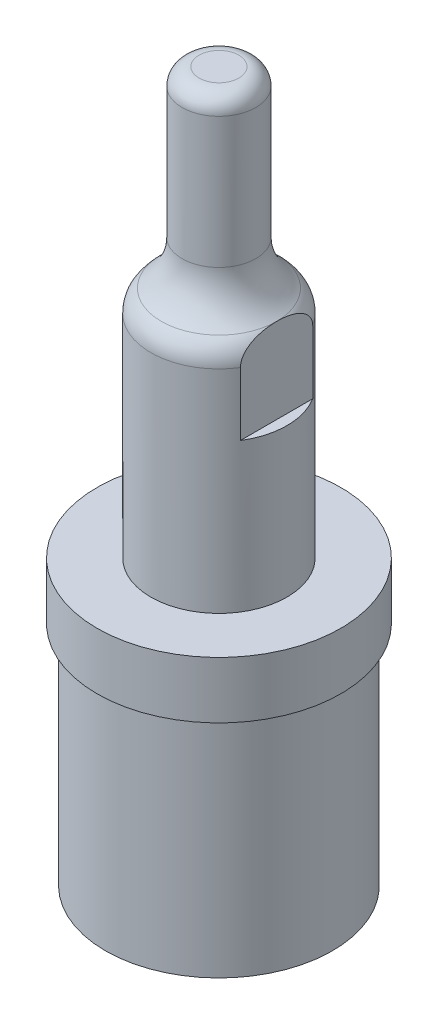
ISO-10303-21;
HEADER;
FILE_DESCRIPTION(('STEP AP214'),'2;1');
FILE_NAME('part.step','',(''),(''),'','','');
FILE_SCHEMA(('AUTOMOTIVE_DESIGN { 1 0 10303 214 1 1 1 1 }'));
ENDSEC;
DATA;
#1=APPLICATION_CONTEXT('core data for automotive mechanical design processes');
#2=APPLICATION_PROTOCOL_DEFINITION('international standard','automotive_design',2000,#1);
#3=PRODUCT_CONTEXT('',#1,'mechanical');
#4=PRODUCT('Part','Part','',(#3));
#5=PRODUCT_RELATED_PRODUCT_CATEGORY('part','',(#4));
#6=PRODUCT_DEFINITION_FORMATION('','',#4);
#7=PRODUCT_DEFINITION_CONTEXT('part definition',#1,'design');
#8=PRODUCT_DEFINITION('design','',#6,#7);
#9=PRODUCT_DEFINITION_SHAPE('','',#8);
#10=(LENGTH_UNIT() NAMED_UNIT(*) SI_UNIT(.MILLI.,.METRE.));
#11=(NAMED_UNIT(*) PLANE_ANGLE_UNIT() SI_UNIT($,.RADIAN.));
#12=(NAMED_UNIT(*) SI_UNIT($,.STERADIAN.) SOLID_ANGLE_UNIT());
#13=UNCERTAINTY_MEASURE_WITH_UNIT(LENGTH_MEASURE(1.E-05),#10,'distance_accuracy_value','');
#14=(GEOMETRIC_REPRESENTATION_CONTEXT(3) GLOBAL_UNCERTAINTY_ASSIGNED_CONTEXT((#13)) GLOBAL_UNIT_ASSIGNED_CONTEXT((#10,
#11,#12)) REPRESENTATION_CONTEXT('',''));
#15=CARTESIAN_POINT('',(0.,0.,0.));
#16=DIRECTION('',(0.,0.,1.));
#17=DIRECTION('',(1.,0.,0.));
#18=AXIS2_PLACEMENT_3D('',#15,#16,#17);
#19=CARTESIAN_POINT('',(0.,87.322098783502,0.));
#20=DIRECTION('',(0.,-1.,0.));
#21=DIRECTION('',(0.,0.,-1.));
#22=AXIS2_PLACEMENT_3D('',#19,#20,#21);
#23=TOROIDAL_SURFACE('',#22,7.,5.);
#24=CARTESIAN_POINT('',(-10.1666666666667,91.1914943722499,0.));
#25=CARTESIAN_POINT('',(-10.1666666666667,91.191506160614,-0.314516340477252));
#26=CARTESIAN_POINT('',(-10.1666666666667,91.1796408195498,-0.629088679360618));
#27=CARTESIAN_POINT('',(-10.1666666666667,91.1311122225233,-1.25661974532318));
#28=CARTESIAN_POINT('',(-10.1666666666667,91.0944278606387,-1.56957687040855));
#29=CARTESIAN_POINT('',(-10.1666666666667,90.9932609242664,-2.18959658683757));
#30=CARTESIAN_POINT('',(-10.1666666666667,90.9289086065314,-2.49667984223719));
#31=CARTESIAN_POINT('',(-10.1666666666667,90.7673827468785,-3.10182700025219));
#32=CARTESIAN_POINT('',(-10.1666666666667,90.6702707165493,-3.39990667399585));
#33=CARTESIAN_POINT('',(-10.1666666666667,90.4649616318458,-3.90944267609055));
#34=CARTESIAN_POINT('',(-10.1666666666667,90.3652586014093,-4.12428096224194));
#35=CARTESIAN_POINT('',(-10.1666666666667,90.1398738656151,-4.54019588368301));
#36=CARTESIAN_POINT('',(-10.1666666666667,90.0141834632251,-4.74126788183008));
#37=CARTESIAN_POINT('',(-10.1666666666667,89.7319876062989,-5.12491116960149));
#38=CARTESIAN_POINT('',(-10.1666666666667,89.575134078164,-5.30723451843851));
#39=CARTESIAN_POINT('',(-10.1666666666667,89.3169075524954,-5.55655948708843));
#40=CARTESIAN_POINT('',(-10.1666666666667,89.2270581827006,-5.63560772988774));
#41=CARTESIAN_POINT('',(-10.1666666666667,89.0398492007953,-5.78419602792949));
#42=CARTESIAN_POINT('',(-10.1666666666667,88.9424935910319,-5.85374109619261));
#43=CARTESIAN_POINT('',(-10.1666666666667,88.7043777054261,-6.004708852963));
#44=CARTESIAN_POINT('',(-10.1666666666667,88.5605777819698,-6.08143926547859));
#45=CARTESIAN_POINT('',(-10.1666666666667,88.2623046149878,-6.21013372051192));
#46=CARTESIAN_POINT('',(-10.1666666666667,88.1078388804566,-6.26211498753035));
#47=CARTESIAN_POINT('',(-10.1666666666667,87.7912581296236,-6.33817681629202));
#48=CARTESIAN_POINT('',(-10.1666666666667,87.6291084569419,-6.36211530892655));
#49=CARTESIAN_POINT('',(-10.1666666666667,87.3031652686577,-6.37979822710876));
#50=CARTESIAN_POINT('',(-10.1666666666667,87.1393720492714,-6.37354799937884));
#51=CARTESIAN_POINT('',(-10.1666666666667,86.8283165893434,-6.33301701032067));
#52=CARTESIAN_POINT('',(-10.1666666666667,86.6807578688158,-6.30094905745306));
#53=CARTESIAN_POINT('',(-10.1666666666667,86.3927568364649,-6.2135656943352));
#54=CARTESIAN_POINT('',(-10.1666666666667,86.2523151263568,-6.15824832210008));
#55=CARTESIAN_POINT('',(-10.1666666666667,85.9749737183359,-6.02424505400624));
#56=CARTESIAN_POINT('',(-10.1666666666667,85.8385486331851,-5.94458531296482));
#57=CARTESIAN_POINT('',(-10.1666666666667,85.5783546324541,-5.76684847671764));
#58=CARTESIAN_POINT('',(-10.1666666666667,85.4545930426994,-5.66876081297574));
#59=CARTESIAN_POINT('',(-10.1666666666667,85.1571270280625,-5.40077291813447));
#60=CARTESIAN_POINT('',(-10.1666666666667,84.992569461589,-5.22070731769872));
#61=CARTESIAN_POINT('',(-10.1666666666667,84.6942161424363,-4.836693389626));
#62=CARTESIAN_POINT('',(-10.1666666666667,84.5604888546468,-4.6326933970504));
#63=CARTESIAN_POINT('',(-10.1666666666667,84.3482870603166,-4.25745822759663));
#64=CARTESIAN_POINT('',(-10.1666666666667,84.2641650234201,-4.08934073774941));
#65=CARTESIAN_POINT('',(-10.1666666666667,84.1108871937879,-3.74634824925059));
#66=CARTESIAN_POINT('',(-10.1666666666667,84.0417400318126,-3.57146942176701));
#67=CARTESIAN_POINT('',(-10.1666666666667,83.9167374375909,-3.21660666599961));
#68=CARTESIAN_POINT('',(-10.1666666666667,83.860914441346,-3.03661144972391));
#69=CARTESIAN_POINT('',(-10.1666666666667,83.7613217278641,-2.67329299918218));
#70=CARTESIAN_POINT('',(-10.1666666666667,83.7175563849337,-2.48996858278148));
#71=CARTESIAN_POINT('',(-10.1666666666667,83.6142316245268,-1.9931129266992));
#72=CARTESIAN_POINT('',(-10.1666666666667,83.5647728150733,-1.67746606829269));
#73=CARTESIAN_POINT('',(-10.1666666666667,83.4925251318969,-1.04301805785404));
#74=CARTESIAN_POINT('',(-10.1666666666667,83.4697594427694,-0.724214405922573));
#75=CARTESIAN_POINT('',(-10.1666666666667,83.4488718444241,-0.0857390094152501));
#76=CARTESIAN_POINT('',(-10.1666666666667,83.4507562777562,0.233932937420648));
#77=CARTESIAN_POINT('',(-10.1666666666667,83.4793440438544,0.872012939291929));
#78=CARTESIAN_POINT('',(-10.1666666666667,83.5060296364433,1.1904217343809));
#79=CARTESIAN_POINT('',(-10.1666666666667,83.5710276289022,1.7008777030109));
#80=CARTESIAN_POINT('',(-10.1666666666667,83.6008139582872,1.89402793457452));
#81=CARTESIAN_POINT('',(-10.1666666666667,83.6716002149387,2.27824592033061));
#82=CARTESIAN_POINT('',(-10.1666666666667,83.712597333453,2.46931418368795));
#83=CARTESIAN_POINT('',(-10.1666666666667,83.8069650313993,2.84798694959647));
#84=CARTESIAN_POINT('',(-10.1666666666667,83.8603094867809,3.0355978747318));
#85=CARTESIAN_POINT('',(-10.1666666666667,83.9809155044474,3.40624098003433));
#86=CARTESIAN_POINT('',(-10.1666666666667,84.0481719238614,3.58927482427513));
#87=CARTESIAN_POINT('',(-10.1666666666667,84.2271327338105,4.01785551301749));
#88=CARTESIAN_POINT('',(-10.1666666666667,84.3459954186121,4.26050126246966));
#89=CARTESIAN_POINT('',(-10.1666666666667,84.6185177425266,4.7256455590055));
#90=CARTESIAN_POINT('',(-10.1666666666667,84.7721333588391,4.94816910073534));
#91=CARTESIAN_POINT('',(-10.1666666666667,85.0717320112034,5.30619507222789));
#92=CARTESIAN_POINT('',(-10.1666666666667,85.208833956332,5.44908235803831));
#93=CARTESIAN_POINT('',(-10.1666666666667,85.5040275178185,5.71133576647294));
#94=CARTESIAN_POINT('',(-10.1666666666667,85.6620906110436,5.83073331424164));
#95=CARTESIAN_POINT('',(-10.1666666666667,85.9682288753814,6.02064186757491));
#96=CARTESIAN_POINT('',(-10.1666666666667,86.1132551669939,6.09604445650148));
#97=CARTESIAN_POINT('',(-10.1666666666667,86.4138925735734,6.22170975102752));
#98=CARTESIAN_POINT('',(-10.1666666666667,86.5694984357657,6.27198483041304));
#99=CARTESIAN_POINT('',(-10.1666666666667,86.8880269374447,6.344231271334));
#100=CARTESIAN_POINT('',(-10.1666666666667,87.0509813875065,6.36606425435808));
#101=CARTESIAN_POINT('',(-10.1666666666667,87.3781197953547,6.37930779164143));
#102=CARTESIAN_POINT('',(-10.1666666666667,87.5423034871552,6.37072474777622));
#103=CARTESIAN_POINT('',(-10.1666666666667,87.8530935376116,6.3257519669378));
#104=CARTESIAN_POINT('',(-10.1666666666667,88.0000442579573,6.29167795338531));
#105=CARTESIAN_POINT('',(-10.1666666666667,88.2865752841712,6.20054433096879));
#106=CARTESIAN_POINT('',(-10.1666666666667,88.4261547232685,6.14348202574474));
#107=CARTESIAN_POINT('',(-10.1666666666667,88.7023924325015,6.00581050648202));
#108=CARTESIAN_POINT('',(-10.1666666666667,88.838504298393,5.92411408468422));
#109=CARTESIAN_POINT('',(-10.1666666666667,89.0978328803734,5.74245656392665));
#110=CARTESIAN_POINT('',(-10.1666666666667,89.2210436367677,5.6424870817255));
#111=CARTESIAN_POINT('',(-10.1666666666667,89.518253374807,5.3687089417677));
#112=CARTESIAN_POINT('',(-10.1666666666667,89.68276858171,5.1845919067523));
#113=CARTESIAN_POINT('',(-10.1666666666667,89.98053299688,4.79246411768566));
#114=CARTESIAN_POINT('',(-10.1666666666667,90.1136940524868,4.58438838921328));
#115=CARTESIAN_POINT('',(-10.1666666666667,90.3250722406846,4.20106743541536));
#116=CARTESIAN_POINT('',(-10.1666666666667,90.4089196109268,4.02885232496996));
#117=CARTESIAN_POINT('',(-10.1666666666667,90.5612902392211,3.67769529670693));
#118=CARTESIAN_POINT('',(-10.1666666666667,90.6298040693446,3.49874931891196));
#119=CARTESIAN_POINT('',(-10.1666666666667,90.7531318892356,3.13615544279278));
#120=CARTESIAN_POINT('',(-10.1666666666667,90.8079388057516,2.95250517055124));
#121=CARTESIAN_POINT('',(-10.1666666666667,90.9052882077467,2.5820530567179));
#122=CARTESIAN_POINT('',(-10.1666666666667,90.9478329724258,2.39525180764837));
#123=CARTESIAN_POINT('',(-10.1666666666667,91.0206306484438,2.02601637223212));
#124=CARTESIAN_POINT('',(-10.1666666666667,91.0512583806633,1.84365513426205));
#125=CARTESIAN_POINT('',(-10.1666666666667,91.1031355815882,1.47761993200159));
#126=CARTESIAN_POINT('',(-10.1666666666667,91.1243851736032,1.29394598500378));
#127=CARTESIAN_POINT('',(-10.1666666666667,91.1581790274387,0.925423045040219));
#128=CARTESIAN_POINT('',(-10.1666666666667,91.1707052476343,0.740572410040675));
#129=CARTESIAN_POINT('',(-10.1666666666667,91.1873599069988,0.370487685726622));
#130=CARTESIAN_POINT('',(-10.1666666666667,91.1914874287748,0.185253556734769));
#131=CARTESIAN_POINT('',(-10.1666666666667,91.1914943722499,0.));
#132=B_SPLINE_CURVE_WITH_KNOTS('',3,(#24,#25,#26,#27,#28,#29,#30,#31,#32,#33,#34,#35,#36,#37,
#38,#39,#40,#41,#42,#43,#44,#45,#46,#47,#48,#49,#50,#51,#52,#53,#54,#55,#56,#57,#58,#59,#60,#61,
#62,#63,#64,#65,#66,#67,#68,#69,#70,#71,#72,#73,#74,#75,#76,#77,#78,#79,#80,#81,#82,#83,#84,#85,
#86,#87,#88,#89,#90,#91,#92,#93,#94,#95,#96,#97,#98,#99,#100,#101,#102,#103,#104,#105,#106,#107,
#108,#109,#110,#111,#112,#113,#114,#115,#116,#117,#118,#119,#120,#121,#122,#123,#124,#125,#126,
#127,#128,#129,#130,#131),.UNSPECIFIED.,.T.,.F.,(4,2,2,2,2,2,2,2,2,2,2,2,2,2,2,2,2,2,2,2,2,2,2,
2,2,2,2,2,2,2,2,2,2,2,2,2,2,2,2,2,2,2,2,2,2,2,2,2,2,2,2,2,2,4),(0.,0.943411920242691,
1.88762712149213,2.82744494883423,3.76550785057956,4.47456125164987,5.18385233242858,
5.90156291032129,6.2600608617349,6.61836896573053,7.10524661092061,7.59178490995162,
8.08077757256535,8.56968363289483,9.02065055458564,9.47165554036603,9.94380120126148,
10.4162184720272,11.1438939723032,11.8731701839749,12.436373361768,12.9999002825705,
13.5647853578136,14.1298750944783,15.0869199409483,16.0447954246408,17.0029173773932,
17.9603545160973,18.5463796778325,19.1322581510764,19.716908194933,20.3013424947613,
21.1095739203164,21.9167872061402,22.5088232877688,23.100061861133,23.5884083797602,
24.0765141795948,24.5669859851947,25.0573545638694,25.5078845896571,25.9584674747446,
26.4329186262409,26.9075879933622,27.6441415051446,28.3827417600901,28.9565859008803,
29.530781910073,30.1052736161294,30.6796584708683,31.2341416057015,31.7886174496292,
32.3442366784966,32.8999165946045),.UNSPECIFIED.);
#133=CARTESIAN_POINT('',(-10.1666666666667,91.1914943722499,0.));
#134=VERTEX_POINT('',#133);
#135=CARTESIAN_POINT('',(-10.1666666666667,87.322098783502,-6.37486383296843));
#136=VERTEX_POINT('',#135);
#137=EDGE_CURVE('E98',#134,#136,#132,.T.);
#138=ORIENTED_EDGE('',*,*,#137,.F.);
#139=CARTESIAN_POINT('',(0.,91.1914943722499,0.));
#140=DIRECTION('',(0.,1.,0.));
#141=DIRECTION('',(0.,0.,1.));
#142=AXIS2_PLACEMENT_3D('',#139,#140,#141);
#143=CIRCLE('',#142,10.1666666666667);
#144=CARTESIAN_POINT('',(10.1666666666667,91.1914943722499,0.));
#145=VERTEX_POINT('',#144);
#146=EDGE_CURVE('E156',#145,#134,#143,.T.);
#147=ORIENTED_EDGE('',*,*,#146,.F.);
#148=CARTESIAN_POINT('',(10.1666666666667,91.1914943722499,0.));
#149=CARTESIAN_POINT('',(10.1666666666667,91.191506160614,0.314516340477252));
#150=CARTESIAN_POINT('',(10.1666666666667,91.1796408195498,0.629088679360618));
#151=CARTESIAN_POINT('',(10.1666666666667,91.1311122225233,1.25661974532318));
#152=CARTESIAN_POINT('',(10.1666666666667,91.0944278606387,1.56957687040855));
#153=CARTESIAN_POINT('',(10.1666666666667,90.9932609242664,2.18959658683757));
#154=CARTESIAN_POINT('',(10.1666666666667,90.9289086065314,2.49667984223719));
#155=CARTESIAN_POINT('',(10.1666666666667,90.7673827468785,3.10182700025219));
#156=CARTESIAN_POINT('',(10.1666666666667,90.6702707165493,3.39990667399585));
#157=CARTESIAN_POINT('',(10.1666666666667,90.4649616318458,3.90944267609055));
#158=CARTESIAN_POINT('',(10.1666666666667,90.3652586014093,4.12428096224194));
#159=CARTESIAN_POINT('',(10.1666666666667,90.1398738656151,4.54019588368301));
#160=CARTESIAN_POINT('',(10.1666666666667,90.0141834632251,4.74126788183008));
#161=CARTESIAN_POINT('',(10.1666666666667,89.7319876062989,5.12491116960149));
#162=CARTESIAN_POINT('',(10.1666666666667,89.575134078164,5.30723451843851));
#163=CARTESIAN_POINT('',(10.1666666666667,89.3169075524954,5.55655948708843));
#164=CARTESIAN_POINT('',(10.1666666666667,89.2270581827006,5.63560772988774));
#165=CARTESIAN_POINT('',(10.1666666666667,89.0398492007953,5.78419602792949));
#166=CARTESIAN_POINT('',(10.1666666666667,88.9424935910319,5.85374109619261));
#167=CARTESIAN_POINT('',(10.1666666666667,88.7043777054261,6.004708852963));
#168=CARTESIAN_POINT('',(10.1666666666667,88.5605777819698,6.08143926547859));
#169=CARTESIAN_POINT('',(10.1666666666667,88.2623046149878,6.21013372051192));
#170=CARTESIAN_POINT('',(10.1666666666667,88.1078388804566,6.26211498753035));
#171=CARTESIAN_POINT('',(10.1666666666667,87.7912581296236,6.33817681629202));
#172=CARTESIAN_POINT('',(10.1666666666667,87.6291084569419,6.36211530892655));
#173=CARTESIAN_POINT('',(10.1666666666667,87.3031652686577,6.37979822710876));
#174=CARTESIAN_POINT('',(10.1666666666667,87.1393720492714,6.37354799937884));
#175=CARTESIAN_POINT('',(10.1666666666667,86.8283165893434,6.33301701032067));
#176=CARTESIAN_POINT('',(10.1666666666667,86.6807578688158,6.30094905745306));
#177=CARTESIAN_POINT('',(10.1666666666667,86.3927568364649,6.2135656943352));
#178=CARTESIAN_POINT('',(10.1666666666667,86.2523151263568,6.15824832210008));
#179=CARTESIAN_POINT('',(10.1666666666667,85.9749737183359,6.02424505400624));
#180=CARTESIAN_POINT('',(10.1666666666667,85.8385486331851,5.94458531296482));
#181=CARTESIAN_POINT('',(10.1666666666667,85.5783546324541,5.76684847671764));
#182=CARTESIAN_POINT('',(10.1666666666667,85.4545930426994,5.66876081297574));
#183=CARTESIAN_POINT('',(10.1666666666667,85.1571270280625,5.40077291813447));
#184=CARTESIAN_POINT('',(10.1666666666667,84.992569461589,5.22070731769872));
#185=CARTESIAN_POINT('',(10.1666666666667,84.6942161424363,4.836693389626));
#186=CARTESIAN_POINT('',(10.1666666666667,84.5604888546468,4.6326933970504));
#187=CARTESIAN_POINT('',(10.1666666666667,84.3482870603166,4.25745822759663));
#188=CARTESIAN_POINT('',(10.1666666666667,84.2641650234201,4.08934073774941));
#189=CARTESIAN_POINT('',(10.1666666666667,84.1108871937879,3.74634824925059));
#190=CARTESIAN_POINT('',(10.1666666666667,84.0417400318126,3.57146942176701));
#191=CARTESIAN_POINT('',(10.1666666666667,83.9167374375909,3.21660666599961));
#192=CARTESIAN_POINT('',(10.1666666666667,83.860914441346,3.03661144972391));
#193=CARTESIAN_POINT('',(10.1666666666667,83.7613217278641,2.67329299918218));
#194=CARTESIAN_POINT('',(10.1666666666667,83.7175563849337,2.48996858278148));
#195=CARTESIAN_POINT('',(10.1666666666667,83.6142316245268,1.9931129266992));
#196=CARTESIAN_POINT('',(10.1666666666667,83.5647728150733,1.67746606829269));
#197=CARTESIAN_POINT('',(10.1666666666667,83.4925251318969,1.04301805785404));
#198=CARTESIAN_POINT('',(10.1666666666667,83.4697594427694,0.724214405922573));
#199=CARTESIAN_POINT('',(10.1666666666667,83.4488718444241,0.0857390094152501));
#200=CARTESIAN_POINT('',(10.1666666666667,83.4507562777562,-0.233932937420648));
#201=CARTESIAN_POINT('',(10.1666666666667,83.4793440438544,-0.872012939291929));
#202=CARTESIAN_POINT('',(10.1666666666667,83.5060296364433,-1.1904217343809));
#203=CARTESIAN_POINT('',(10.1666666666667,83.5710276289022,-1.7008777030109));
#204=CARTESIAN_POINT('',(10.1666666666667,83.6008139582872,-1.89402793457452));
#205=CARTESIAN_POINT('',(10.1666666666667,83.6716002149387,-2.27824592033061));
#206=CARTESIAN_POINT('',(10.1666666666667,83.712597333453,-2.46931418368795));
#207=CARTESIAN_POINT('',(10.1666666666667,83.8069650313993,-2.84798694959647));
#208=CARTESIAN_POINT('',(10.1666666666667,83.8603094867809,-3.0355978747318));
#209=CARTESIAN_POINT('',(10.1666666666667,83.9809155044474,-3.40624098003433));
#210=CARTESIAN_POINT('',(10.1666666666667,84.0481719238614,-3.58927482427513));
#211=CARTESIAN_POINT('',(10.1666666666667,84.2271327338105,-4.01785551301749));
#212=CARTESIAN_POINT('',(10.1666666666667,84.3459954186121,-4.26050126246966));
#213=CARTESIAN_POINT('',(10.1666666666667,84.6185177425266,-4.7256455590055));
#214=CARTESIAN_POINT('',(10.1666666666667,84.7721333588391,-4.94816910073534));
#215=CARTESIAN_POINT('',(10.1666666666667,85.0717320112034,-5.30619507222789));
#216=CARTESIAN_POINT('',(10.1666666666667,85.208833956332,-5.44908235803831));
#217=CARTESIAN_POINT('',(10.1666666666667,85.5040275178185,-5.71133576647294));
#218=CARTESIAN_POINT('',(10.1666666666667,85.6620906110436,-5.83073331424164));
#219=CARTESIAN_POINT('',(10.1666666666667,85.9682288753814,-6.02064186757491));
#220=CARTESIAN_POINT('',(10.1666666666667,86.1132551669939,-6.09604445650148));
#221=CARTESIAN_POINT('',(10.1666666666667,86.4138925735734,-6.22170975102752));
#222=CARTESIAN_POINT('',(10.1666666666667,86.5694984357657,-6.27198483041304));
#223=CARTESIAN_POINT('',(10.1666666666667,86.8880269374447,-6.344231271334));
#224=CARTESIAN_POINT('',(10.1666666666667,87.0509813875065,-6.36606425435808));
#225=CARTESIAN_POINT('',(10.1666666666667,87.3781197953547,-6.37930779164143));
#226=CARTESIAN_POINT('',(10.1666666666667,87.5423034871552,-6.37072474777622));
#227=CARTESIAN_POINT('',(10.1666666666667,87.8530935376116,-6.3257519669378));
#228=CARTESIAN_POINT('',(10.1666666666667,88.0000442579573,-6.29167795338531));
#229=CARTESIAN_POINT('',(10.1666666666667,88.2865752841712,-6.20054433096879));
#230=CARTESIAN_POINT('',(10.1666666666667,88.4261547232685,-6.14348202574474));
#231=CARTESIAN_POINT('',(10.1666666666667,88.7023924325015,-6.00581050648202));
#232=CARTESIAN_POINT('',(10.1666666666667,88.838504298393,-5.92411408468422));
#233=CARTESIAN_POINT('',(10.1666666666667,89.0978328803734,-5.74245656392665));
#234=CARTESIAN_POINT('',(10.1666666666667,89.2210436367677,-5.6424870817255));
#235=CARTESIAN_POINT('',(10.1666666666667,89.518253374807,-5.3687089417677));
#236=CARTESIAN_POINT('',(10.1666666666667,89.68276858171,-5.1845919067523));
#237=CARTESIAN_POINT('',(10.1666666666667,89.98053299688,-4.79246411768566));
#238=CARTESIAN_POINT('',(10.1666666666667,90.1136940524868,-4.58438838921328));
#239=CARTESIAN_POINT('',(10.1666666666667,90.3250722406846,-4.20106743541536));
#240=CARTESIAN_POINT('',(10.1666666666667,90.4089196109268,-4.02885232496996));
#241=CARTESIAN_POINT('',(10.1666666666667,90.5612902392211,-3.67769529670693));
#242=CARTESIAN_POINT('',(10.1666666666667,90.6298040693446,-3.49874931891196));
#243=CARTESIAN_POINT('',(10.1666666666667,90.7531318892356,-3.13615544279278));
#244=CARTESIAN_POINT('',(10.1666666666667,90.8079388057516,-2.95250517055124));
#245=CARTESIAN_POINT('',(10.1666666666667,90.9052882077467,-2.5820530567179));
#246=CARTESIAN_POINT('',(10.1666666666667,90.9478329724258,-2.39525180764837));
#247=CARTESIAN_POINT('',(10.1666666666667,91.0206306484438,-2.02601637223212));
#248=CARTESIAN_POINT('',(10.1666666666667,91.0512583806633,-1.84365513426205));
#249=CARTESIAN_POINT('',(10.1666666666667,91.1031355815882,-1.47761993200159));
#250=CARTESIAN_POINT('',(10.1666666666667,91.1243851736032,-1.29394598500378));
#251=CARTESIAN_POINT('',(10.1666666666667,91.1581790274387,-0.925423045040219));
#252=CARTESIAN_POINT('',(10.1666666666667,91.1707052476343,-0.740572410040675));
#253=CARTESIAN_POINT('',(10.1666666666667,91.1873599069988,-0.370487685726622));
#254=CARTESIAN_POINT('',(10.1666666666667,91.1914874287748,-0.185253556734769));
#255=CARTESIAN_POINT('',(10.1666666666667,91.1914943722499,0.));
#256=B_SPLINE_CURVE_WITH_KNOTS('',3,(#148,#149,#150,#151,#152,#153,#154,#155,#156,#157,#158,
#159,#160,#161,#162,#163,#164,#165,#166,#167,#168,#169,#170,#171,#172,#173,#174,#175,#176,#177,
#178,#179,#180,#181,#182,#183,#184,#185,#186,#187,#188,#189,#190,#191,#192,#193,#194,#195,#196,
#197,#198,#199,#200,#201,#202,#203,#204,#205,#206,#207,#208,#209,#210,#211,#212,#213,#214,#215,
#216,#217,#218,#219,#220,#221,#222,#223,#224,#225,#226,#227,#228,#229,#230,#231,#232,#233,#234,
#235,#236,#237,#238,#239,#240,#241,#242,#243,#244,#245,#246,#247,#248,#249,#250,#251,#252,#253,
#254,#255),.UNSPECIFIED.,.T.,.F.,(4,2,2,2,2,2,2,2,2,2,2,2,2,2,2,2,2,2,2,2,2,2,2,2,2,2,2,2,2,2,2,
2,2,2,2,2,2,2,2,2,2,2,2,2,2,2,2,2,2,2,2,2,2,4),(0.,0.943411920242691,1.88762712149213,
2.82744494883423,3.76550785057956,4.47456125164987,5.18385233242858,5.90156291032129,
6.2600608617349,6.61836896573053,7.10524661092061,7.59178490995162,8.08077757256535,
8.56968363289483,9.02065055458564,9.47165554036603,9.94380120126148,10.4162184720272,
11.1438939723032,11.8731701839749,12.436373361768,12.9999002825705,13.5647853578136,
14.1298750944783,15.0869199409483,16.0447954246408,17.0029173773932,17.9603545160973,
18.5463796778325,19.1322581510764,19.716908194933,20.3013424947613,21.1095739203164,
21.9167872061402,22.5088232877688,23.100061861133,23.5884083797602,24.0765141795948,
24.5669859851947,25.0573545638694,25.5078845896571,25.9584674747446,26.4329186262409,
26.9075879933622,27.6441415051446,28.3827417600901,28.9565859008803,29.530781910073,
30.1052736161294,30.6796584708683,31.2341416057015,31.7886174496292,32.3442366784966,
32.8999165946045),.UNSPECIFIED.);
#257=CARTESIAN_POINT('',(10.1666666666667,87.322098783502,-6.37486383296842));
#258=VERTEX_POINT('',#257);
#259=EDGE_CURVE('E130',#258,#145,#256,.T.);
#260=ORIENTED_EDGE('',*,*,#259,.F.);
#261=CARTESIAN_POINT('',(0.,87.322098783502,0.));
#262=DIRECTION('',(0.,-1.,0.));
#263=DIRECTION('',(0.,0.,-1.));
#264=AXIS2_PLACEMENT_3D('',#261,#262,#263);
#265=CIRCLE('',#264,12.);
#266=EDGE_CURVE('E110',#136,#258,#265,.T.);
#267=ORIENTED_EDGE('',*,*,#266,.F.);
#268=EDGE_LOOP('',(#138,#147,#260,#267));
#269=FACE_BOUND('',#268,.T.);
#270=ADVANCED_FACE('F43',(#269),#23,.T.);
#271=CARTESIAN_POINT('',(0.,40.,0.));
#272=DIRECTION('',(0.,-1.,0.));
#273=DIRECTION('',(0.,0.,-1.));
#274=AXIS2_PLACEMENT_3D('',#271,#272,#273);
#275=CYLINDRICAL_SURFACE('',#274,20.);
#276=CARTESIAN_POINT('',(0.,40.,0.));
#277=DIRECTION('',(0.,1.,0.));
#278=DIRECTION('',(0.,0.,1.));
#279=AXIS2_PLACEMENT_3D('',#276,#277,#278);
#280=CIRCLE('',#279,20.);
#281=CARTESIAN_POINT('',(0.,40.,20.));
#282=VERTEX_POINT('',#281);
#283=EDGE_CURVE('E144',#282,#282,#280,.T.);
#284=ORIENTED_EDGE('',*,*,#283,.F.);
#285=EDGE_LOOP('',(#284));
#286=FACE_BOUND('',#285,.T.);
#287=CARTESIAN_POINT('',(0.,0.,0.));
#288=DIRECTION('',(0.,1.,0.));
#289=DIRECTION('',(0.,0.,1.));
#290=AXIS2_PLACEMENT_3D('',#287,#288,#289);
#291=CIRCLE('',#290,20.);
#292=CARTESIAN_POINT('',(0.,0.,20.));
#293=VERTEX_POINT('',#292);
#294=EDGE_CURVE('E140',#293,#293,#291,.T.);
#295=ORIENTED_EDGE('',*,*,#294,.T.);
#296=EDGE_LOOP('',(#295));
#297=FACE_BOUND('',#296,.T.);
#298=ADVANCED_FACE('F228',(#286,#297),#275,.T.);
#299=CARTESIAN_POINT('',(0.,0.,0.));
#300=DIRECTION('',(0.,1.,0.));
#301=DIRECTION('',(0.,0.,1.));
#302=AXIS2_PLACEMENT_3D('',#299,#300,#301);
#303=PLANE('',#302);
#304=CARTESIAN_POINT('',(0.,0.,0.));
#305=DIRECTION('',(0.,-1.,0.));
#306=DIRECTION('',(0.,0.,-1.));
#307=AXIS2_PLACEMENT_3D('',#304,#305,#306);
#308=CIRCLE('',#307,4.);
#309=CARTESIAN_POINT('',(0.,0.,-4.));
#310=VERTEX_POINT('',#309);
#311=EDGE_CURVE('E126',#310,#310,#308,.T.);
#312=ORIENTED_EDGE('',*,*,#311,.F.);
#313=EDGE_LOOP('',(#312));
#314=FACE_BOUND('',#313,.T.);
#315=ORIENTED_EDGE('',*,*,#294,.F.);
#316=EDGE_LOOP('',(#315));
#317=FACE_BOUND('',#316,.T.);
#318=ADVANCED_FACE('F224',(#314,#317),#303,.F.);
#319=CARTESIAN_POINT('',(0.,50.,0.));
#320=DIRECTION('',(0.,-1.,0.));
#321=DIRECTION('',(0.,0.,-1.));
#322=AXIS2_PLACEMENT_3D('',#319,#320,#321);
#323=CYLINDRICAL_SURFACE('',#322,21.5);
#324=CARTESIAN_POINT('',(0.,50.,0.));
#325=DIRECTION('',(0.,1.,0.));
#326=DIRECTION('',(0.,0.,1.));
#327=AXIS2_PLACEMENT_3D('',#324,#325,#326);
#328=CIRCLE('',#327,21.5);
#329=CARTESIAN_POINT('',(0.,50.,21.5));
#330=VERTEX_POINT('',#329);
#331=EDGE_CURVE('E136',#330,#330,#328,.T.);
#332=ORIENTED_EDGE('',*,*,#331,.F.);
#333=EDGE_LOOP('',(#332));
#334=FACE_BOUND('',#333,.T.);
#335=CARTESIAN_POINT('',(0.,40.,0.));
#336=DIRECTION('',(0.,1.,0.));
#337=DIRECTION('',(0.,0.,1.));
#338=AXIS2_PLACEMENT_3D('',#335,#336,#337);
#339=CIRCLE('',#338,21.5);
#340=CARTESIAN_POINT('',(0.,40.,21.5));
#341=VERTEX_POINT('',#340);
#342=EDGE_CURVE('E135',#341,#341,#339,.T.);
#343=ORIENTED_EDGE('',*,*,#342,.T.);
#344=EDGE_LOOP('',(#343));
#345=FACE_BOUND('',#344,.T.);
#346=ADVANCED_FACE('F217',(#334,#345),#323,.T.);
#347=CARTESIAN_POINT('',(0.,50.,0.));
#348=DIRECTION('',(0.,1.,0.));
#349=DIRECTION('',(0.,0.,1.));
#350=AXIS2_PLACEMENT_3D('',#347,#348,#349);
#351=PLANE('',#350);
#352=CARTESIAN_POINT('',(0.,50.,0.));
#353=DIRECTION('',(0.,1.,0.));
#354=DIRECTION('',(0.,0.,1.));
#355=AXIS2_PLACEMENT_3D('',#352,#353,#354);
#356=CIRCLE('',#355,12.);
#357=CARTESIAN_POINT('',(0.,50.,12.));
#358=VERTEX_POINT('',#357);
#359=EDGE_CURVE('E125',#358,#358,#356,.T.);
#360=ORIENTED_EDGE('',*,*,#359,.F.);
#361=EDGE_LOOP('',(#360));
#362=FACE_BOUND('',#361,.T.);
#363=ORIENTED_EDGE('',*,*,#331,.T.);
#364=EDGE_LOOP('',(#363));
#365=FACE_BOUND('',#364,.T.);
#366=ADVANCED_FACE('F214',(#362,#365),#351,.T.);
#367=CARTESIAN_POINT('',(0.,40.,0.));
#368=DIRECTION('',(0.,1.,0.));
#369=DIRECTION('',(0.,0.,1.));
#370=AXIS2_PLACEMENT_3D('',#367,#368,#369);
#371=PLANE('',#370);
#372=ORIENTED_EDGE('',*,*,#283,.T.);
#373=EDGE_LOOP('',(#372));
#374=FACE_BOUND('',#373,.T.);
#375=ORIENTED_EDGE('',*,*,#342,.F.);
#376=EDGE_LOOP('',(#375));
#377=FACE_BOUND('',#376,.T.);
#378=ADVANCED_FACE('F205',(#374,#377),#371,.F.);
#379=CARTESIAN_POINT('',(0.,90.,0.));
#380=DIRECTION('',(0.,-1.,0.));
#381=DIRECTION('',(0.,0.,-1.));
#382=AXIS2_PLACEMENT_3D('',#379,#380,#381);
#383=CYLINDRICAL_SURFACE('',#382,12.);
#384=CARTESIAN_POINT('',(10.1666666666667,87.322098783502,6.37486383296843));
#385=VERTEX_POINT('',#384);
#386=CARTESIAN_POINT('',(-10.1666666666667,87.322098783502,6.37486383296842));
#387=VERTEX_POINT('',#386);
#388=EDGE_CURVE('E162',#385,#387,#265,.T.);
#389=ORIENTED_EDGE('',*,*,#388,.T.);
#390=DIRECTION('',(0.,-1.,0.));
#391=VECTOR('',#390,1.);
#392=CARTESIAN_POINT('',(-10.1666666666667,90.,6.37486383296842));
#393=LINE('',#392,#391);
#394=CARTESIAN_POINT('',(-10.1666666666667,76.1914943722499,6.37486383296843));
#395=VERTEX_POINT('',#394);
#396=EDGE_CURVE('E59',#387,#395,#393,.T.);
#397=ORIENTED_EDGE('',*,*,#396,.T.);
#398=CARTESIAN_POINT('',(0.,76.1914943722499,0.));
#399=DIRECTION('',(0.,-1.,0.));
#400=DIRECTION('',(0.,0.,-1.));
#401=AXIS2_PLACEMENT_3D('',#398,#399,#400);
#402=CIRCLE('',#401,12.);
#403=CARTESIAN_POINT('',(-10.1666666666667,76.1914943722499,-6.37486383296843));
#404=VERTEX_POINT('',#403);
#405=EDGE_CURVE('E11',#395,#404,#402,.T.);
#406=ORIENTED_EDGE('',*,*,#405,.T.);
#407=DIRECTION('',(0.,-1.,0.));
#408=VECTOR('',#407,1.);
#409=CARTESIAN_POINT('',(-10.1666666666667,90.,-6.37486383296842));
#410=LINE('',#409,#408);
#411=EDGE_CURVE('E112',#404,#136,#410,.F.);
#412=ORIENTED_EDGE('',*,*,#411,.T.);
#413=ORIENTED_EDGE('',*,*,#266,.T.);
#414=DIRECTION('',(0.,-1.,0.));
#415=VECTOR('',#414,1.);
#416=CARTESIAN_POINT('',(10.1666666666667,90.,-6.37486383296842));
#417=LINE('',#416,#415);
#418=CARTESIAN_POINT('',(10.1666666666667,76.1914943722499,-6.37486383296842));
#419=VERTEX_POINT('',#418);
#420=EDGE_CURVE('E67',#258,#419,#417,.T.);
#421=ORIENTED_EDGE('',*,*,#420,.T.);
#422=CARTESIAN_POINT('',(0.,76.1914943722499,0.));
#423=DIRECTION('',(0.,-1.,0.));
#424=DIRECTION('',(0.,0.,-1.));
#425=AXIS2_PLACEMENT_3D('',#422,#423,#424);
#426=CIRCLE('',#425,12.);
#427=CARTESIAN_POINT('',(10.1666666666667,76.1914943722499,6.37486383296842));
#428=VERTEX_POINT('',#427);
#429=EDGE_CURVE('E52',#419,#428,#426,.T.);
#430=ORIENTED_EDGE('',*,*,#429,.T.);
#431=DIRECTION('',(0.,-1.,0.));
#432=VECTOR('',#431,1.);
#433=CARTESIAN_POINT('',(10.1666666666667,90.,6.37486383296842));
#434=LINE('',#433,#432);
#435=EDGE_CURVE('E100',#428,#385,#434,.F.);
#436=ORIENTED_EDGE('',*,*,#435,.T.);
#437=EDGE_LOOP('',(#389,#397,#406,#412,#413,#421,#430,#436));
#438=FACE_BOUND('',#437,.T.);
#439=ORIENTED_EDGE('',*,*,#359,.T.);
#440=EDGE_LOOP('',(#439));
#441=FACE_BOUND('',#440,.T.);
#442=ADVANCED_FACE('F106',(#438,#441),#383,.T.);
#443=CARTESIAN_POINT('',(0.,125.,0.));
#444=DIRECTION('',(0.,1.,0.));
#445=DIRECTION('',(0.,0.,1.));
#446=AXIS2_PLACEMENT_3D('',#443,#444,#445);
#447=PLANE('',#446);
#448=CARTESIAN_POINT('',(0.,125.,0.));
#449=DIRECTION('',(0.,1.,0.));
#450=DIRECTION('',(0.,0.,1.));
#451=AXIS2_PLACEMENT_3D('',#448,#449,#450);
#452=CIRCLE('',#451,3.5);
#453=CARTESIAN_POINT('',(0.,125.,3.5));
#454=VERTEX_POINT('',#453);
#455=EDGE_CURVE('E163',#454,#454,#452,.T.);
#456=ORIENTED_EDGE('',*,*,#455,.T.);
#457=EDGE_LOOP('',(#456));
#458=FACE_BOUND('',#457,.T.);
#459=ADVANCED_FACE('F204',(#458),#447,.T.);
#460=CARTESIAN_POINT('',(0.,125.,0.));
#461=DIRECTION('',(0.,-1.,0.));
#462=DIRECTION('',(0.,0.,-1.));
#463=AXIS2_PLACEMENT_3D('',#460,#461,#462);
#464=CYLINDRICAL_SURFACE('',#463,6.5);
#465=CARTESIAN_POINT('',(0.,122.,0.));
#466=DIRECTION('',(0.,1.,0.));
#467=DIRECTION('',(0.,0.,1.));
#468=AXIS2_PLACEMENT_3D('',#465,#466,#467);
#469=CIRCLE('',#468,6.5);
#470=CARTESIAN_POINT('',(0.,122.,6.5));
#471=VERTEX_POINT('',#470);
#472=EDGE_CURVE('E131',#471,#471,#469,.F.);
#473=ORIENTED_EDGE('',*,*,#472,.T.);
#474=EDGE_LOOP('',(#473));
#475=FACE_BOUND('',#474,.T.);
#476=CARTESIAN_POINT('',(0.,98.9302855497459,0.));
#477=DIRECTION('',(0.,-1.,0.));
#478=DIRECTION('',(0.,0.,-1.));
#479=AXIS2_PLACEMENT_3D('',#476,#477,#478);
#480=CIRCLE('',#479,6.5);
#481=CARTESIAN_POINT('',(0.,98.9302855497459,-6.5));
#482=VERTEX_POINT('',#481);
#483=EDGE_CURVE('E148',#482,#482,#480,.F.);
#484=ORIENTED_EDGE('',*,*,#483,.T.);
#485=EDGE_LOOP('',(#484));
#486=FACE_BOUND('',#485,.T.);
#487=ADVANCED_FACE('F208',(#475,#486),#464,.T.);
#488=CARTESIAN_POINT('',(0.,98.9302855497459,0.));
#489=DIRECTION('',(0.,-1.,0.));
#490=DIRECTION('',(0.,0.,-1.));
#491=AXIS2_PLACEMENT_3D('',#488,#489,#490);
#492=TOROIDAL_SURFACE('',#491,16.5,10.);
#493=ORIENTED_EDGE('',*,*,#146,.T.);
#494=EDGE_CURVE('E155',#134,#145,#143,.T.);
#495=ORIENTED_EDGE('',*,*,#494,.T.);
#496=EDGE_LOOP('',(#493,#495));
#497=FACE_BOUND('',#496,.T.);
#498=ORIENTED_EDGE('',*,*,#483,.F.);
#499=EDGE_LOOP('',(#498));
#500=FACE_BOUND('',#499,.T.);
#501=ADVANCED_FACE('F212',(#497,#500),#492,.F.);
#502=EDGE_CURVE('E177',#387,#134,#132,.T.);
#503=ORIENTED_EDGE('',*,*,#502,.F.);
#504=ORIENTED_EDGE('',*,*,#388,.F.);
#505=EDGE_CURVE('E176',#145,#385,#256,.T.);
#506=ORIENTED_EDGE('',*,*,#505,.F.);
#507=ORIENTED_EDGE('',*,*,#494,.F.);
#508=EDGE_LOOP('',(#503,#504,#506,#507));
#509=FACE_BOUND('',#508,.T.);
#510=ADVANCED_FACE('F182',(#509),#23,.T.);
#511=CARTESIAN_POINT('',(0.,122.,0.));
#512=DIRECTION('',(0.,1.,0.));
#513=DIRECTION('',(0.,0.,1.));
#514=AXIS2_PLACEMENT_3D('',#511,#512,#513);
#515=TOROIDAL_SURFACE('',#514,3.5,3.);
#516=ORIENTED_EDGE('',*,*,#472,.F.);
#517=EDGE_LOOP('',(#516));
#518=FACE_BOUND('',#517,.T.);
#519=ORIENTED_EDGE('',*,*,#455,.F.);
#520=EDGE_LOOP('',(#519));
#521=FACE_BOUND('',#520,.T.);
#522=ADVANCED_FACE('F45',(#518,#521),#515,.T.);
#523=CARTESIAN_POINT('',(0.,-5.,0.));
#524=DIRECTION('',(0.,1.,0.));
#525=DIRECTION('',(0.,0.,1.));
#526=AXIS2_PLACEMENT_3D('',#523,#524,#525);
#527=CYLINDRICAL_SURFACE('',#526,4.);
#528=CARTESIAN_POINT('',(0.,-5.,0.));
#529=DIRECTION('',(0.,-1.,0.));
#530=DIRECTION('',(0.,0.,-1.));
#531=AXIS2_PLACEMENT_3D('',#528,#529,#530);
#532=CIRCLE('',#531,4.);
#533=CARTESIAN_POINT('',(0.,-5.,-4.));
#534=VERTEX_POINT('',#533);
#535=EDGE_CURVE('E121',#534,#534,#532,.T.);
#536=ORIENTED_EDGE('',*,*,#535,.F.);
#537=EDGE_LOOP('',(#536));
#538=FACE_BOUND('',#537,.T.);
#539=ORIENTED_EDGE('',*,*,#311,.T.);
#540=EDGE_LOOP('',(#539));
#541=FACE_BOUND('',#540,.T.);
#542=ADVANCED_FACE('F197',(#538,#541),#527,.T.);
#543=CARTESIAN_POINT('',(0.,-5.,0.));
#544=DIRECTION('',(0.,-1.,0.));
#545=DIRECTION('',(0.,0.,-1.));
#546=AXIS2_PLACEMENT_3D('',#543,#544,#545);
#547=PLANE('',#546);
#548=ORIENTED_EDGE('',*,*,#535,.T.);
#549=EDGE_LOOP('',(#548));
#550=FACE_BOUND('',#549,.T.);
#551=ADVANCED_FACE('F194',(#550),#547,.T.);
#552=CARTESIAN_POINT('',(10.1666666666667,76.1914943722499,-21.5));
#553=DIRECTION('',(0.,-1.,0.));
#554=DIRECTION('',(0.,0.,-1.));
#555=AXIS2_PLACEMENT_3D('',#552,#553,#554);
#556=PLANE('',#555);
#557=DIRECTION('',(0.,0.,1.));
#558=VECTOR('',#557,1.);
#559=CARTESIAN_POINT('',(10.1666666666667,76.1914943722499,-21.5));
#560=LINE('',#559,#558);
#561=EDGE_CURVE('E94',#419,#428,#560,.T.);
#562=ORIENTED_EDGE('',*,*,#561,.T.);
#563=ORIENTED_EDGE('',*,*,#429,.F.);
#564=EDGE_LOOP('',(#562,#563));
#565=FACE_BOUND('',#564,.T.);
#566=ADVANCED_FACE('F93',(#565),#556,.F.);
#567=CARTESIAN_POINT('',(10.1666666666667,91.1914943722499,-21.5));
#568=DIRECTION('',(-1.,0.,0.));
#569=DIRECTION('',(0.,-1.,0.));
#570=AXIS2_PLACEMENT_3D('',#567,#568,#569);
#571=PLANE('',#570);
#572=ORIENTED_EDGE('',*,*,#259,.T.);
#573=ORIENTED_EDGE('',*,*,#505,.T.);
#574=ORIENTED_EDGE('',*,*,#435,.F.);
#575=ORIENTED_EDGE('',*,*,#561,.F.);
#576=ORIENTED_EDGE('',*,*,#420,.F.);
#577=EDGE_LOOP('',(#572,#573,#574,#575,#576));
#578=FACE_BOUND('',#577,.T.);
#579=ADVANCED_FACE('F99',(#578),#571,.F.);
#580=CARTESIAN_POINT('',(-10.1666666666667,76.1914943722499,-21.5));
#581=DIRECTION('',(0.,-1.,0.));
#582=DIRECTION('',(0.,0.,-1.));
#583=AXIS2_PLACEMENT_3D('',#580,#581,#582);
#584=PLANE('',#583);
#585=DIRECTION('',(0.,0.,1.));
#586=VECTOR('',#585,1.);
#587=CARTESIAN_POINT('',(-10.1666666666667,76.1914943722499,-21.5));
#588=LINE('',#587,#586);
#589=EDGE_CURVE('E102',#404,#395,#588,.T.);
#590=ORIENTED_EDGE('',*,*,#589,.F.);
#591=ORIENTED_EDGE('',*,*,#405,.F.);
#592=EDGE_LOOP('',(#590,#591));
#593=FACE_BOUND('',#592,.T.);
#594=ADVANCED_FACE('F188',(#593),#584,.F.);
#595=CARTESIAN_POINT('',(-10.1666666666667,91.1914943722499,-21.5));
#596=DIRECTION('',(1.,0.,0.));
#597=DIRECTION('',(0.,1.,0.));
#598=AXIS2_PLACEMENT_3D('',#595,#596,#597);
#599=PLANE('',#598);
#600=ORIENTED_EDGE('',*,*,#502,.T.);
#601=ORIENTED_EDGE('',*,*,#137,.T.);
#602=ORIENTED_EDGE('',*,*,#411,.F.);
#603=ORIENTED_EDGE('',*,*,#589,.T.);
#604=ORIENTED_EDGE('',*,*,#396,.F.);
#605=EDGE_LOOP('',(#600,#601,#602,#603,#604));
#606=FACE_BOUND('',#605,.T.);
#607=ADVANCED_FACE('F189',(#606),#599,.F.);
#608=CLOSED_SHELL('',(#270,#298,#318,#346,#366,#378,#442,#459,#487,#501,#510,#522,#542,#551,
#566,#579,#594,#607));
#609=MANIFOLD_SOLID_BREP('B2',#608);
#610=ADVANCED_BREP_SHAPE_REPRESENTATION('',(#18,#609),#14);
#611=SHAPE_DEFINITION_REPRESENTATION(#9,#610);
ENDSEC;
END-ISO-10303-21;
